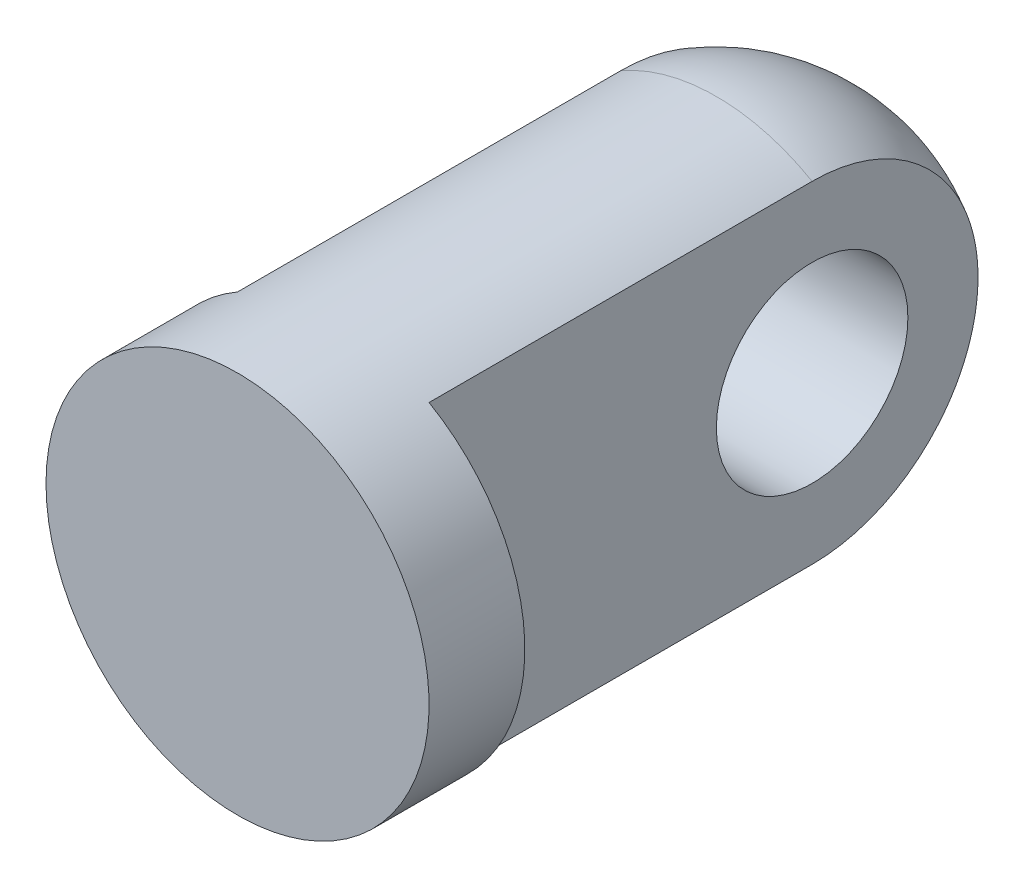
ISO-10303-21;
HEADER;
FILE_DESCRIPTION(('STEP AP214'),'2;1');
FILE_NAME('part.step','',(''),(''),'','','');
FILE_SCHEMA(('AUTOMOTIVE_DESIGN { 1 0 10303 214 1 1 1 1 }'));
ENDSEC;
DATA;
#1=APPLICATION_CONTEXT('core data for automotive mechanical design processes');
#2=APPLICATION_PROTOCOL_DEFINITION('international standard','automotive_design',2000,#1);
#3=PRODUCT_CONTEXT('',#1,'mechanical');
#4=PRODUCT('Part','Part','',(#3));
#5=PRODUCT_RELATED_PRODUCT_CATEGORY('part','',(#4));
#6=PRODUCT_DEFINITION_FORMATION('','',#4);
#7=PRODUCT_DEFINITION_CONTEXT('part definition',#1,'design');
#8=PRODUCT_DEFINITION('design','',#6,#7);
#9=PRODUCT_DEFINITION_SHAPE('','',#8);
#10=(LENGTH_UNIT() NAMED_UNIT(*) SI_UNIT(.MILLI.,.METRE.));
#11=(NAMED_UNIT(*) PLANE_ANGLE_UNIT() SI_UNIT($,.RADIAN.));
#12=(NAMED_UNIT(*) SI_UNIT($,.STERADIAN.) SOLID_ANGLE_UNIT());
#13=UNCERTAINTY_MEASURE_WITH_UNIT(LENGTH_MEASURE(1.E-05),#10,'distance_accuracy_value','');
#14=(GEOMETRIC_REPRESENTATION_CONTEXT(3) GLOBAL_UNCERTAINTY_ASSIGNED_CONTEXT((#13)) GLOBAL_UNIT_ASSIGNED_CONTEXT((#10,
#11,#12)) REPRESENTATION_CONTEXT('',''));
#15=CARTESIAN_POINT('',(0.,0.,0.));
#16=DIRECTION('',(0.,0.,1.));
#17=DIRECTION('',(1.,0.,0.));
#18=AXIS2_PLACEMENT_3D('',#15,#16,#17);
#19=CARTESIAN_POINT('',(0.,0.,-22.225));
#20=DIRECTION('',(0.,0.,-1.));
#21=DIRECTION('',(-1.,0.,0.));
#22=AXIS2_PLACEMENT_3D('',#19,#20,#21);
#23=CYLINDRICAL_SURFACE('',#22,6.35);
#24=CARTESIAN_POINT('',(0.,0.,0.));
#25=DIRECTION('',(0.,0.,-1.));
#26=DIRECTION('',(-1.,0.,0.));
#27=AXIS2_PLACEMENT_3D('',#24,#25,#26);
#28=CIRCLE('',#27,6.35);
#29=CARTESIAN_POINT('',(-6.35,0.,0.));
#30=VERTEX_POINT('',#29);
#31=EDGE_CURVE('E112',#30,#30,#28,.T.);
#32=ORIENTED_EDGE('',*,*,#31,.T.);
#33=EDGE_LOOP('',(#32));
#34=FACE_BOUND('',#33,.T.);
#35=DIRECTION('',(0.,0.,-1.));
#36=VECTOR('',#35,1.);
#37=CARTESIAN_POINT('',(3.175,-5.49926131403118,-22.225));
#38=LINE('',#37,#36);
#39=CARTESIAN_POINT('',(3.175,-5.49926131403118,-3.175));
#40=VERTEX_POINT('',#39);
#41=CARTESIAN_POINT('',(3.175,-5.49926131403118,-15.875));
#42=VERTEX_POINT('',#41);
#43=EDGE_CURVE('E56',#40,#42,#38,.T.);
#44=ORIENTED_EDGE('',*,*,#43,.F.);
#45=CARTESIAN_POINT('',(0.,0.,-3.175));
#46=DIRECTION('',(0.,0.,-1.));
#47=DIRECTION('',(-1.,0.,0.));
#48=AXIS2_PLACEMENT_3D('',#45,#46,#47);
#49=CIRCLE('',#48,6.35);
#50=CARTESIAN_POINT('',(3.175,5.49926131403118,-3.175));
#51=VERTEX_POINT('',#50);
#52=EDGE_CURVE('E11',#51,#40,#49,.T.);
#53=ORIENTED_EDGE('',*,*,#52,.F.);
#54=DIRECTION('',(0.,0.,-1.));
#55=VECTOR('',#54,1.);
#56=CARTESIAN_POINT('',(3.175,5.49926131403118,-22.225));
#57=LINE('',#56,#55);
#58=CARTESIAN_POINT('',(3.175,5.49926131403118,-15.875));
#59=VERTEX_POINT('',#58);
#60=EDGE_CURVE('E89',#59,#51,#57,.F.);
#61=ORIENTED_EDGE('',*,*,#60,.F.);
#62=CARTESIAN_POINT('',(0.,0.,-15.875));
#63=DIRECTION('',(0.,0.,-1.));
#64=DIRECTION('',(-1.,0.,0.));
#65=AXIS2_PLACEMENT_3D('',#62,#63,#64);
#66=CIRCLE('',#65,6.35);
#67=CARTESIAN_POINT('',(-3.175,5.49926131403118,-15.875));
#68=VERTEX_POINT('',#67);
#69=EDGE_CURVE('E108',#68,#59,#66,.T.);
#70=ORIENTED_EDGE('',*,*,#69,.F.);
#71=DIRECTION('',(0.,0.,-1.));
#72=VECTOR('',#71,1.);
#73=CARTESIAN_POINT('',(-3.175,5.49926131403118,-22.225));
#74=LINE('',#73,#72);
#75=CARTESIAN_POINT('',(-3.175,5.49926131403118,-3.175));
#76=VERTEX_POINT('',#75);
#77=EDGE_CURVE('E64',#68,#76,#74,.F.);
#78=ORIENTED_EDGE('',*,*,#77,.T.);
#79=CARTESIAN_POINT('',(0.,0.,-3.175));
#80=DIRECTION('',(0.,0.,1.));
#81=DIRECTION('',(1.,0.,0.));
#82=AXIS2_PLACEMENT_3D('',#79,#80,#81);
#83=CIRCLE('',#82,6.35);
#84=CARTESIAN_POINT('',(-3.175,-5.49926131403118,-3.175));
#85=VERTEX_POINT('',#84);
#86=EDGE_CURVE('E119',#76,#85,#83,.T.);
#87=ORIENTED_EDGE('',*,*,#86,.T.);
#88=DIRECTION('',(0.,0.,-1.));
#89=VECTOR('',#88,1.);
#90=CARTESIAN_POINT('',(-3.175,-5.49926131403118,-22.225));
#91=LINE('',#90,#89);
#92=CARTESIAN_POINT('',(-3.175,-5.49926131403118,-15.875));
#93=VERTEX_POINT('',#92);
#94=EDGE_CURVE('E105',#85,#93,#91,.T.);
#95=ORIENTED_EDGE('',*,*,#94,.T.);
#96=EDGE_CURVE('E94',#42,#93,#66,.T.);
#97=ORIENTED_EDGE('',*,*,#96,.F.);
#98=EDGE_LOOP('',(#44,#53,#61,#70,#78,#87,#95,#97));
#99=FACE_BOUND('',#98,.T.);
#100=ADVANCED_FACE('F39',(#34,#99),#23,.T.);
#101=CARTESIAN_POINT('',(0.,0.,-15.875));
#102=DIRECTION('',(0.,0.,-1.));
#103=DIRECTION('',(1.,0.,0.));
#104=AXIS2_PLACEMENT_3D('',#101,#102,#103);
#105=SPHERICAL_SURFACE('',#104,6.35);
#106=CARTESIAN_POINT('',(3.175,0.,-15.875));
#107=DIRECTION('',(1.,0.,0.));
#108=DIRECTION('',(0.,0.,-1.));
#109=AXIS2_PLACEMENT_3D('',#106,#107,#108);
#110=CIRCLE('',#109,5.49926131403118);
#111=EDGE_CURVE('E49',#42,#59,#110,.T.);
#112=ORIENTED_EDGE('',*,*,#111,.F.);
#113=ORIENTED_EDGE('',*,*,#96,.T.);
#114=CARTESIAN_POINT('',(-3.175,0.,-15.875));
#115=DIRECTION('',(1.,0.,0.));
#116=DIRECTION('',(0.,0.,-1.));
#117=AXIS2_PLACEMENT_3D('',#114,#115,#116);
#118=CIRCLE('',#117,5.49926131403118);
#119=EDGE_CURVE('E116',#93,#68,#118,.T.);
#120=ORIENTED_EDGE('',*,*,#119,.T.);
#121=ORIENTED_EDGE('',*,*,#69,.T.);
#122=EDGE_LOOP('',(#112,#113,#120,#121));
#123=FACE_BOUND('',#122,.T.);
#124=ADVANCED_FACE('F126',(#123),#105,.T.);
#125=CARTESIAN_POINT('',(0.,0.,0.));
#126=DIRECTION('',(0.,0.,-1.));
#127=DIRECTION('',(-1.,0.,0.));
#128=AXIS2_PLACEMENT_3D('',#125,#126,#127);
#129=PLANE('',#128);
#130=ORIENTED_EDGE('',*,*,#31,.F.);
#131=EDGE_LOOP('',(#130));
#132=FACE_BOUND('',#131,.T.);
#133=ADVANCED_FACE('F41',(#132),#129,.F.);
#134=CARTESIAN_POINT('',(-3.175,-6.35,-3.175));
#135=DIRECTION('',(0.,0.,1.));
#136=DIRECTION('',(1.,0.,0.));
#137=AXIS2_PLACEMENT_3D('',#134,#135,#136);
#138=PLANE('',#137);
#139=DIRECTION('',(0.,1.,0.));
#140=VECTOR('',#139,1.);
#141=CARTESIAN_POINT('',(-3.175,-6.35,-3.175));
#142=LINE('',#141,#140);
#143=EDGE_CURVE('E96',#85,#76,#142,.T.);
#144=ORIENTED_EDGE('',*,*,#143,.F.);
#145=ORIENTED_EDGE('',*,*,#86,.F.);
#146=EDGE_LOOP('',(#144,#145));
#147=FACE_BOUND('',#146,.T.);
#148=ADVANCED_FACE('F130',(#147),#138,.F.);
#149=CARTESIAN_POINT('',(-3.17500000000001,-6.35,-63.1791794608881));
#150=DIRECTION('',(1.,0.,0.));
#151=DIRECTION('',(0.,0.,-1.));
#152=AXIS2_PLACEMENT_3D('',#149,#150,#151);
#153=PLANE('',#152);
#154=CARTESIAN_POINT('',(-3.175,0.,-15.875));
#155=DIRECTION('',(-1.,0.,0.));
#156=DIRECTION('',(0.,0.,1.));
#157=AXIS2_PLACEMENT_3D('',#154,#155,#156);
#158=CIRCLE('',#157,3.175);
#159=CARTESIAN_POINT('',(-3.175,0.,-12.7));
#160=VERTEX_POINT('',#159);
#161=EDGE_CURVE('E205',#160,#160,#158,.T.);
#162=ORIENTED_EDGE('',*,*,#161,.F.);
#163=EDGE_LOOP('',(#162));
#164=FACE_BOUND('',#163,.T.);
#165=ORIENTED_EDGE('',*,*,#143,.T.);
#166=ORIENTED_EDGE('',*,*,#77,.F.);
#167=ORIENTED_EDGE('',*,*,#119,.F.);
#168=ORIENTED_EDGE('',*,*,#94,.F.);
#169=EDGE_LOOP('',(#165,#166,#167,#168));
#170=FACE_BOUND('',#169,.T.);
#171=ADVANCED_FACE('F127',(#164,#170),#153,.F.);
#172=CARTESIAN_POINT('',(3.175,-6.35,-3.175));
#173=DIRECTION('',(0.,0.,-1.));
#174=DIRECTION('',(-1.,0.,0.));
#175=AXIS2_PLACEMENT_3D('',#172,#173,#174);
#176=PLANE('',#175);
#177=ORIENTED_EDGE('',*,*,#52,.T.);
#178=DIRECTION('',(0.,1.,0.));
#179=VECTOR('',#178,1.);
#180=CARTESIAN_POINT('',(3.175,-6.35,-3.175));
#181=LINE('',#180,#179);
#182=EDGE_CURVE('E85',#40,#51,#181,.T.);
#183=ORIENTED_EDGE('',*,*,#182,.T.);
#184=EDGE_LOOP('',(#177,#183));
#185=FACE_BOUND('',#184,.T.);
#186=ADVANCED_FACE('F84',(#185),#176,.T.);
#187=CARTESIAN_POINT('',(3.17500000000001,-6.35,-63.1791794608881));
#188=DIRECTION('',(1.,0.,0.));
#189=DIRECTION('',(0.,0.,-1.));
#190=AXIS2_PLACEMENT_3D('',#187,#188,#189);
#191=PLANE('',#190);
#192=CARTESIAN_POINT('',(3.175,0.,-15.875));
#193=DIRECTION('',(1.,0.,0.));
#194=DIRECTION('',(0.,0.,-1.));
#195=AXIS2_PLACEMENT_3D('',#192,#193,#194);
#196=CIRCLE('',#195,3.175);
#197=CARTESIAN_POINT('',(3.175,0.,-19.05));
#198=VERTEX_POINT('',#197);
#199=EDGE_CURVE('E43',#198,#198,#196,.T.);
#200=ORIENTED_EDGE('',*,*,#199,.F.);
#201=EDGE_LOOP('',(#200));
#202=FACE_BOUND('',#201,.T.);
#203=ORIENTED_EDGE('',*,*,#43,.T.);
#204=ORIENTED_EDGE('',*,*,#111,.T.);
#205=ORIENTED_EDGE('',*,*,#60,.T.);
#206=ORIENTED_EDGE('',*,*,#182,.F.);
#207=EDGE_LOOP('',(#203,#204,#205,#206));
#208=FACE_BOUND('',#207,.T.);
#209=ADVANCED_FACE('F88',(#202,#208),#191,.T.);
#210=CARTESIAN_POINT('',(6.35,0.,-15.875));
#211=DIRECTION('',(-1.,0.,0.));
#212=DIRECTION('',(0.,0.,1.));
#213=AXIS2_PLACEMENT_3D('',#210,#211,#212);
#214=CYLINDRICAL_SURFACE('',#213,3.175);
#215=ORIENTED_EDGE('',*,*,#199,.T.);
#216=EDGE_LOOP('',(#215));
#217=FACE_BOUND('',#216,.T.);
#218=ORIENTED_EDGE('',*,*,#161,.T.);
#219=EDGE_LOOP('',(#218));
#220=FACE_BOUND('',#219,.T.);
#221=ADVANCED_FACE('F182',(#217,#220),#214,.F.);
#222=CLOSED_SHELL('',(#100,#124,#133,#148,#171,#186,#209,#221));
#223=MANIFOLD_SOLID_BREP('B2',#222);
#224=ADVANCED_BREP_SHAPE_REPRESENTATION('',(#18,#223),#14);
#225=SHAPE_DEFINITION_REPRESENTATION(#9,#224);
ENDSEC;
END-ISO-10303-21;
